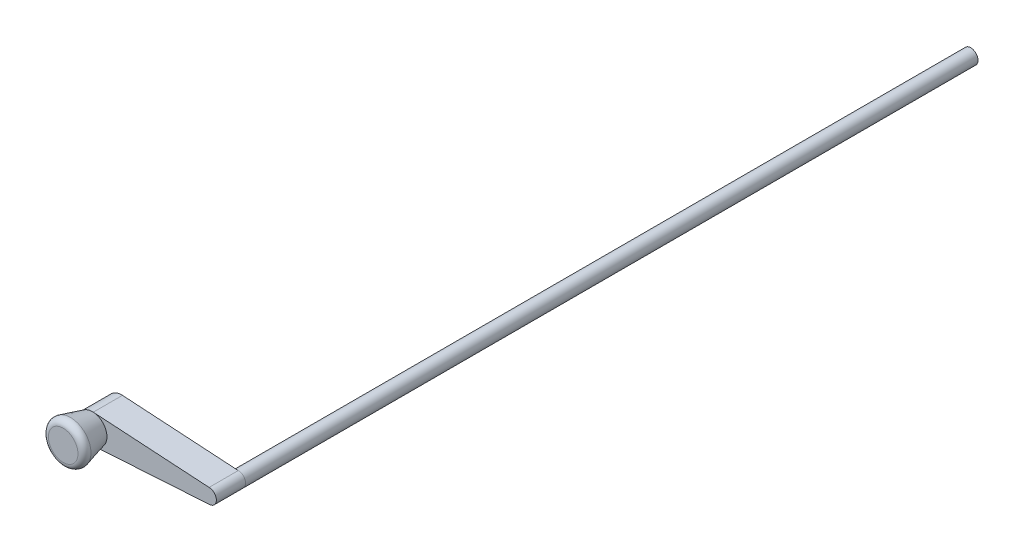
ISO-10303-21;
HEADER;
FILE_DESCRIPTION(('STEP AP214'),'2;1');
FILE_NAME('part.step','',(''),(''),'','','');
FILE_SCHEMA(('AUTOMOTIVE_DESIGN { 1 0 10303 214 1 1 1 1 }'));
ENDSEC;
DATA;
#1=APPLICATION_CONTEXT('core data for automotive mechanical design processes');
#2=APPLICATION_PROTOCOL_DEFINITION('international standard','automotive_design',2000,#1);
#3=PRODUCT_CONTEXT('',#1,'mechanical');
#4=PRODUCT('Part','Part','',(#3));
#5=PRODUCT_RELATED_PRODUCT_CATEGORY('part','',(#4));
#6=PRODUCT_DEFINITION_FORMATION('','',#4);
#7=PRODUCT_DEFINITION_CONTEXT('part definition',#1,'design');
#8=PRODUCT_DEFINITION('design','',#6,#7);
#9=PRODUCT_DEFINITION_SHAPE('','',#8);
#10=(LENGTH_UNIT() NAMED_UNIT(*) SI_UNIT(.MILLI.,.METRE.));
#11=(NAMED_UNIT(*) PLANE_ANGLE_UNIT() SI_UNIT($,.RADIAN.));
#12=(NAMED_UNIT(*) SI_UNIT($,.STERADIAN.) SOLID_ANGLE_UNIT());
#13=UNCERTAINTY_MEASURE_WITH_UNIT(LENGTH_MEASURE(1.E-05),#10,'distance_accuracy_value','');
#14=(GEOMETRIC_REPRESENTATION_CONTEXT(3) GLOBAL_UNCERTAINTY_ASSIGNED_CONTEXT((#13)) GLOBAL_UNIT_ASSIGNED_CONTEXT((#10,
#11,#12)) REPRESENTATION_CONTEXT('',''));
#15=CARTESIAN_POINT('',(0.,0.,0.));
#16=DIRECTION('',(0.,0.,1.));
#17=DIRECTION('',(1.,0.,0.));
#18=AXIS2_PLACEMENT_3D('',#15,#16,#17);
#19=CARTESIAN_POINT('',(0.,0.,-312.42));
#20=DIRECTION('',(0.,0.,1.));
#21=DIRECTION('',(1.,0.,0.));
#22=AXIS2_PLACEMENT_3D('',#19,#20,#21);
#23=CYLINDRICAL_SURFACE('',#22,3.175);
#24=CARTESIAN_POINT('',(0.,0.,38.1));
#25=DIRECTION('',(0.,0.,1.));
#26=DIRECTION('',(1.,0.,0.));
#27=AXIS2_PLACEMENT_3D('',#24,#25,#26);
#28=CIRCLE('',#27,3.175);
#29=CARTESIAN_POINT('',(3.175,0.,38.1));
#30=VERTEX_POINT('',#29);
#31=EDGE_CURVE('E112',#30,#30,#28,.T.);
#32=ORIENTED_EDGE('',*,*,#31,.F.);
#33=EDGE_LOOP('',(#32));
#34=FACE_BOUND('',#33,.T.);
#35=CARTESIAN_POINT('',(0.,0.,-280.67));
#36=DIRECTION('',(0.,0.,-1.));
#37=DIRECTION('',(-1.,0.,0.));
#38=AXIS2_PLACEMENT_3D('',#35,#36,#37);
#39=CIRCLE('',#38,3.175);
#40=CARTESIAN_POINT('',(-3.175,0.,-280.67));
#41=VERTEX_POINT('',#40);
#42=EDGE_CURVE('E124',#41,#41,#39,.F.);
#43=ORIENTED_EDGE('',*,*,#42,.T.);
#44=EDGE_LOOP('',(#43));
#45=FACE_BOUND('',#44,.T.);
#46=ADVANCED_FACE('F43',(#34,#45),#23,.T.);
#47=CARTESIAN_POINT('',(0.,0.,50.8));
#48=DIRECTION('',(0.,0.,-1.));
#49=DIRECTION('',(-1.,0.,0.));
#50=AXIS2_PLACEMENT_3D('',#47,#48,#49);
#51=CYLINDRICAL_SURFACE('',#50,3.18121939871256);
#52=CARTESIAN_POINT('',(0.,0.,38.1));
#53=DIRECTION('',(0.,0.,1.));
#54=DIRECTION('',(-1.,0.,0.));
#55=AXIS2_PLACEMENT_3D('',#52,#53,#54);
#56=CIRCLE('',#55,3.18121939871256);
#57=CARTESIAN_POINT('',(0.,-3.18121939871256,38.1));
#58=VERTEX_POINT('',#57);
#59=CARTESIAN_POINT('',(0.,3.18121939871256,38.1));
#60=VERTEX_POINT('',#59);
#61=EDGE_CURVE('E121',#58,#60,#56,.T.);
#62=ORIENTED_EDGE('',*,*,#61,.T.);
#63=DIRECTION('',(0.,0.,-1.));
#64=VECTOR('',#63,1.);
#65=CARTESIAN_POINT('',(0.,3.18121939871256,50.8));
#66=LINE('',#65,#64);
#67=CARTESIAN_POINT('',(0.,3.18121939871256,50.8));
#68=VERTEX_POINT('',#67);
#69=EDGE_CURVE('E103',#68,#60,#66,.T.);
#70=ORIENTED_EDGE('',*,*,#69,.F.);
#71=CARTESIAN_POINT('',(0.,0.,50.8));
#72=DIRECTION('',(0.,0.,1.));
#73=DIRECTION('',(-1.,0.,0.));
#74=AXIS2_PLACEMENT_3D('',#71,#72,#73);
#75=CIRCLE('',#74,3.18121939871256);
#76=CARTESIAN_POINT('',(0.,-3.18121939871256,50.8));
#77=VERTEX_POINT('',#76);
#78=EDGE_CURVE('E108',#77,#68,#75,.T.);
#79=ORIENTED_EDGE('',*,*,#78,.F.);
#80=DIRECTION('',(0.,0.,-1.));
#81=VECTOR('',#80,1.);
#82=CARTESIAN_POINT('',(0.,-3.18121939871256,50.8));
#83=LINE('',#82,#81);
#84=EDGE_CURVE('E120',#77,#58,#83,.T.);
#85=ORIENTED_EDGE('',*,*,#84,.T.);
#86=EDGE_LOOP('',(#62,#70,#79,#85));
#87=FACE_BOUND('',#86,.T.);
#88=ADVANCED_FACE('F148',(#87),#51,.T.);
#89=CARTESIAN_POINT('',(-50.403125,6.33758552087268,50.8));
#90=DIRECTION('',(-0.0625,-0.998044963916957,0.));
#91=DIRECTION('',(0.998044963916957,-0.0625000000000001,0.));
#92=AXIS2_PLACEMENT_3D('',#89,#90,#91);
#93=PLANE('',#92);
#94=DIRECTION('',(-0.998044963916957,0.0625,0.));
#95=VECTOR('',#94,1.);
#96=CARTESIAN_POINT('',(-50.403125,6.33758552087268,38.1));
#97=LINE('',#96,#95);
#98=CARTESIAN_POINT('',(-50.403125,6.33758552087268,38.1));
#99=VERTEX_POINT('',#98);
#100=EDGE_CURVE('E102',#60,#99,#97,.T.);
#101=ORIENTED_EDGE('',*,*,#100,.T.);
#102=DIRECTION('',(0.,0.,-1.));
#103=VECTOR('',#102,1.);
#104=CARTESIAN_POINT('',(-50.403125,6.33758552087268,50.8));
#105=LINE('',#104,#103);
#106=CARTESIAN_POINT('',(-50.403125,6.33758552087268,50.8));
#107=VERTEX_POINT('',#106);
#108=EDGE_CURVE('E96',#107,#99,#105,.T.);
#109=ORIENTED_EDGE('',*,*,#108,.F.);
#110=DIRECTION('',(-0.998044963916957,0.0625,0.));
#111=VECTOR('',#110,1.);
#112=CARTESIAN_POINT('',(-50.403125,6.33758552087268,50.8));
#113=LINE('',#112,#111);
#114=EDGE_CURVE('E90',#68,#107,#113,.T.);
#115=ORIENTED_EDGE('',*,*,#114,.F.);
#116=ORIENTED_EDGE('',*,*,#69,.T.);
#117=EDGE_LOOP('',(#101,#109,#115,#116));
#118=FACE_BOUND('',#117,.T.);
#119=ADVANCED_FACE('F101',(#118),#93,.F.);
#120=CARTESIAN_POINT('',(-50.8,0.,50.8));
#121=DIRECTION('',(0.,0.,-1.));
#122=DIRECTION('',(-1.,0.,0.));
#123=AXIS2_PLACEMENT_3D('',#120,#121,#122);
#124=CYLINDRICAL_SURFACE('',#123,6.35);
#125=CARTESIAN_POINT('',(-50.8,0.,38.1));
#126=DIRECTION('',(0.,0.,1.));
#127=DIRECTION('',(-1.,0.,0.));
#128=AXIS2_PLACEMENT_3D('',#125,#126,#127);
#129=CIRCLE('',#128,6.35);
#130=CARTESIAN_POINT('',(-50.403125,-6.33758552087268,38.1));
#131=VERTEX_POINT('',#130);
#132=EDGE_CURVE('E78',#99,#131,#129,.T.);
#133=ORIENTED_EDGE('',*,*,#132,.T.);
#134=DIRECTION('',(0.,0.,-1.));
#135=VECTOR('',#134,1.);
#136=CARTESIAN_POINT('',(-50.403125,-6.33758552087268,50.8));
#137=LINE('',#136,#135);
#138=CARTESIAN_POINT('',(-50.403125,-6.33758552087268,50.8));
#139=VERTEX_POINT('',#138);
#140=EDGE_CURVE('E97',#139,#131,#137,.T.);
#141=ORIENTED_EDGE('',*,*,#140,.F.);
#142=CARTESIAN_POINT('',(-50.8,0.,50.8));
#143=DIRECTION('',(0.,0.,1.));
#144=DIRECTION('',(-1.,0.,0.));
#145=AXIS2_PLACEMENT_3D('',#142,#143,#144);
#146=CIRCLE('',#145,6.35);
#147=EDGE_CURVE('E94',#107,#139,#146,.T.);
#148=ORIENTED_EDGE('',*,*,#147,.F.);
#149=ORIENTED_EDGE('',*,*,#108,.T.);
#150=EDGE_LOOP('',(#133,#141,#148,#149));
#151=FACE_BOUND('',#150,.T.);
#152=ADVANCED_FACE('F95',(#151),#124,.T.);
#153=CARTESIAN_POINT('',(0.,-3.18121939871256,50.8));
#154=DIRECTION('',(-0.0625,0.998044963916957,0.));
#155=DIRECTION('',(-0.998044963916957,-0.0625000000000001,0.));
#156=AXIS2_PLACEMENT_3D('',#153,#154,#155);
#157=PLANE('',#156);
#158=DIRECTION('',(0.998044963916957,0.0625,0.));
#159=VECTOR('',#158,1.);
#160=CARTESIAN_POINT('',(0.,-3.18121939871256,38.1));
#161=LINE('',#160,#159);
#162=EDGE_CURVE('E83',#131,#58,#161,.T.);
#163=ORIENTED_EDGE('',*,*,#162,.T.);
#164=ORIENTED_EDGE('',*,*,#84,.F.);
#165=DIRECTION('',(0.998044963916957,0.0625,0.));
#166=VECTOR('',#165,1.);
#167=CARTESIAN_POINT('',(0.,-3.18121939871256,50.8));
#168=LINE('',#167,#166);
#169=EDGE_CURVE('E60',#139,#77,#168,.T.);
#170=ORIENTED_EDGE('',*,*,#169,.F.);
#171=ORIENTED_EDGE('',*,*,#140,.T.);
#172=EDGE_LOOP('',(#163,#164,#170,#171));
#173=FACE_BOUND('',#172,.T.);
#174=ADVANCED_FACE('F162',(#173),#157,.F.);
#175=CARTESIAN_POINT('',(0.,0.,50.8));
#176=DIRECTION('',(0.,0.,-1.));
#177=DIRECTION('',(-1.,0.,0.));
#178=AXIS2_PLACEMENT_3D('',#175,#176,#177);
#179=PLANE('',#178);
#180=CARTESIAN_POINT('',(-50.8,0.,50.8));
#181=DIRECTION('',(0.,0.,1.));
#182=DIRECTION('',(1.,0.,0.));
#183=AXIS2_PLACEMENT_3D('',#180,#181,#182);
#184=CIRCLE('',#183,6.35);
#185=EDGE_CURVE('E106',#139,#107,#184,.T.);
#186=ORIENTED_EDGE('',*,*,#185,.F.);
#187=ORIENTED_EDGE('',*,*,#169,.T.);
#188=ORIENTED_EDGE('',*,*,#78,.T.);
#189=ORIENTED_EDGE('',*,*,#114,.T.);
#190=EDGE_LOOP('',(#186,#187,#188,#189));
#191=FACE_BOUND('',#190,.T.);
#192=ADVANCED_FACE('F105',(#191),#179,.F.);
#193=CARTESIAN_POINT('',(0.,0.,38.1));
#194=DIRECTION('',(0.,0.,-1.));
#195=DIRECTION('',(-1.,0.,0.));
#196=AXIS2_PLACEMENT_3D('',#193,#194,#195);
#197=PLANE('',#196);
#198=ORIENTED_EDGE('',*,*,#31,.T.);
#199=EDGE_LOOP('',(#198));
#200=FACE_BOUND('',#199,.T.);
#201=ORIENTED_EDGE('',*,*,#61,.F.);
#202=ORIENTED_EDGE('',*,*,#162,.F.);
#203=ORIENTED_EDGE('',*,*,#132,.F.);
#204=ORIENTED_EDGE('',*,*,#100,.F.);
#205=EDGE_LOOP('',(#201,#202,#203,#204));
#206=FACE_BOUND('',#205,.T.);
#207=ADVANCED_FACE('F165',(#200,#206),#197,.T.);
#208=CARTESIAN_POINT('',(-50.8,0.,50.8));
#209=DIRECTION('',(0.,0.,1.));
#210=DIRECTION('',(1.,0.,0.));
#211=AXIS2_PLACEMENT_3D('',#208,#209,#210);
#212=CONICAL_SURFACE('',#211,6.35,0.26179938779915);
#213=CARTESIAN_POINT('',(-50.8,0.,60.3025996254396));
#214=DIRECTION('',(0.,0.,1.));
#215=DIRECTION('',(1.,0.,0.));
#216=AXIS2_PLACEMENT_3D('',#213,#214,#215);
#217=CIRCLE('',#216,8.89621389563284);
#218=CARTESIAN_POINT('',(-41.9037861043672,0.,60.3025996254396));
#219=VERTEX_POINT('',#218);
#220=EDGE_CURVE('E11',#219,#219,#217,.F.);
#221=ORIENTED_EDGE('',*,*,#220,.T.);
#222=EDGE_LOOP('',(#221));
#223=FACE_BOUND('',#222,.T.);
#224=ORIENTED_EDGE('',*,*,#147,.T.);
#225=ORIENTED_EDGE('',*,*,#185,.T.);
#226=EDGE_LOOP('',(#224,#225));
#227=FACE_BOUND('',#226,.T.);
#228=ADVANCED_FACE('F111',(#223,#227),#212,.T.);
#229=CARTESIAN_POINT('',(-50.8,0.,63.5));
#230=DIRECTION('',(0.,0.,1.));
#231=DIRECTION('',(1.,0.,0.));
#232=AXIS2_PLACEMENT_3D('',#229,#230,#231);
#233=PLANE('',#232);
#234=CARTESIAN_POINT('',(-50.8,0.,63.5));
#235=DIRECTION('',(0.,0.,1.));
#236=DIRECTION('',(1.,0.,0.));
#237=AXIS2_PLACEMENT_3D('',#234,#235,#236);
#238=CIRCLE('',#237,6.4427622968586);
#239=CARTESIAN_POINT('',(-44.3572377031414,0.,63.5));
#240=VERTEX_POINT('',#239);
#241=EDGE_CURVE('E52',#240,#240,#238,.T.);
#242=ORIENTED_EDGE('',*,*,#241,.T.);
#243=EDGE_LOOP('',(#242));
#244=FACE_BOUND('',#243,.T.);
#245=ADVANCED_FACE('F137',(#244),#233,.T.);
#246=CARTESIAN_POINT('',(0.,0.,-280.67));
#247=DIRECTION('',(0.,0.,-1.));
#248=DIRECTION('',(-1.,0.,0.));
#249=AXIS2_PLACEMENT_3D('',#246,#247,#248);
#250=PLANE('',#249);
#251=ORIENTED_EDGE('',*,*,#42,.F.);
#252=EDGE_LOOP('',(#251));
#253=FACE_BOUND('',#252,.T.);
#254=ADVANCED_FACE('F135',(#253),#250,.T.);
#255=CARTESIAN_POINT('',(-50.8,0.,60.96));
#256=DIRECTION('',(0.,0.,1.));
#257=DIRECTION('',(1.,0.,0.));
#258=AXIS2_PLACEMENT_3D('',#255,#256,#257);
#259=TOROIDAL_SURFACE('',#258,6.4427622968586,2.54);
#260=ORIENTED_EDGE('',*,*,#220,.F.);
#261=EDGE_LOOP('',(#260));
#262=FACE_BOUND('',#261,.T.);
#263=ORIENTED_EDGE('',*,*,#241,.F.);
#264=EDGE_LOOP('',(#263));
#265=FACE_BOUND('',#264,.T.);
#266=ADVANCED_FACE('F45',(#262,#265),#259,.T.);
#267=CLOSED_SHELL('',(#46,#88,#119,#152,#174,#192,#207,#228,#245,#254,#266));
#268=MANIFOLD_SOLID_BREP('B2',#267);
#269=ADVANCED_BREP_SHAPE_REPRESENTATION('',(#18,#268),#14);
#270=SHAPE_DEFINITION_REPRESENTATION(#9,#269);
ENDSEC;
END-ISO-10303-21;
